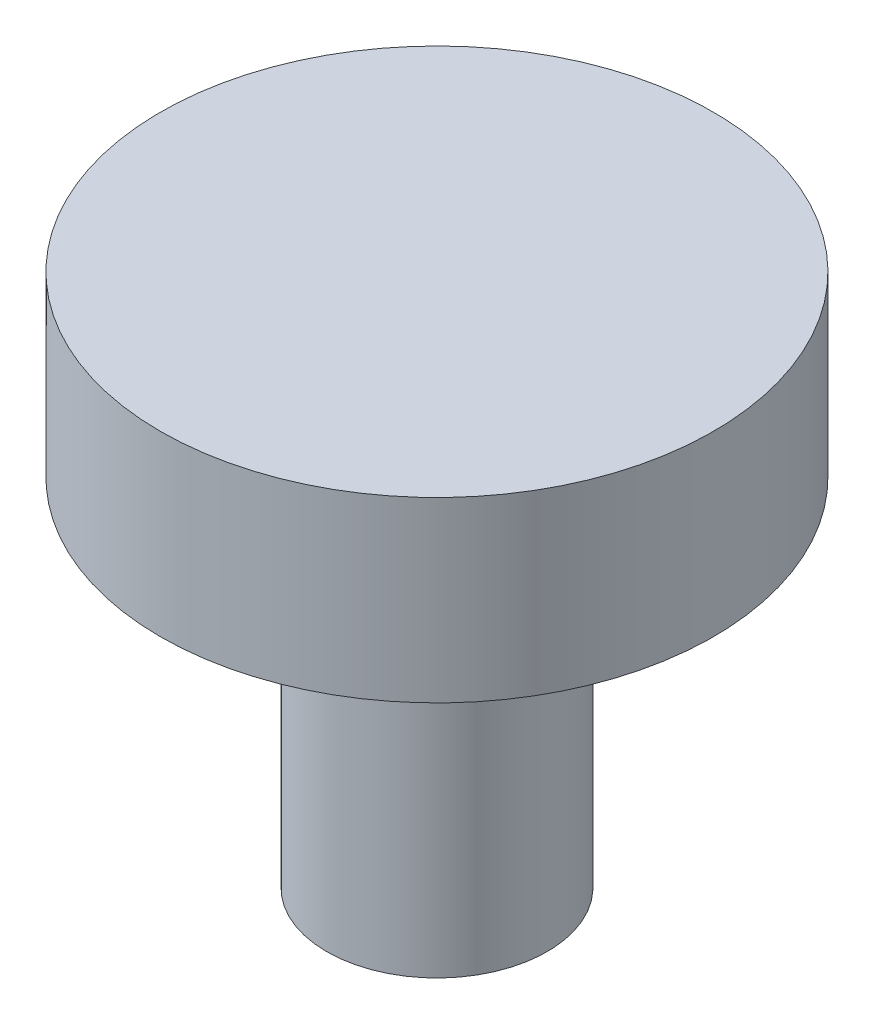
ISO-10303-21;
HEADER;
FILE_DESCRIPTION(('STEP AP214'),'2;1');
FILE_NAME('part.step','',(''),(''),'','','');
FILE_SCHEMA(('AUTOMOTIVE_DESIGN { 1 0 10303 214 1 1 1 1 }'));
ENDSEC;
DATA;
#1=APPLICATION_CONTEXT('core data for automotive mechanical design processes');
#2=APPLICATION_PROTOCOL_DEFINITION('international standard','automotive_design',2000,#1);
#3=PRODUCT_CONTEXT('',#1,'mechanical');
#4=PRODUCT('Part','Part','',(#3));
#5=PRODUCT_RELATED_PRODUCT_CATEGORY('part','',(#4));
#6=PRODUCT_DEFINITION_FORMATION('','',#4);
#7=PRODUCT_DEFINITION_CONTEXT('part definition',#1,'design');
#8=PRODUCT_DEFINITION('design','',#6,#7);
#9=PRODUCT_DEFINITION_SHAPE('','',#8);
#10=(LENGTH_UNIT() NAMED_UNIT(*) SI_UNIT(.MILLI.,.METRE.));
#11=(NAMED_UNIT(*) PLANE_ANGLE_UNIT() SI_UNIT($,.RADIAN.));
#12=(NAMED_UNIT(*) SI_UNIT($,.STERADIAN.) SOLID_ANGLE_UNIT());
#13=UNCERTAINTY_MEASURE_WITH_UNIT(LENGTH_MEASURE(1.E-05),#10,'distance_accuracy_value','');
#14=(GEOMETRIC_REPRESENTATION_CONTEXT(3) GLOBAL_UNCERTAINTY_ASSIGNED_CONTEXT((#13)) GLOBAL_UNIT_ASSIGNED_CONTEXT((#10,
#11,#12)) REPRESENTATION_CONTEXT('',''));
#15=CARTESIAN_POINT('',(0.,0.,0.));
#16=DIRECTION('',(0.,0.,1.));
#17=DIRECTION('',(1.,0.,0.));
#18=AXIS2_PLACEMENT_3D('',#15,#16,#17);
#19=CARTESIAN_POINT('',(0.,50.8,0.));
#20=DIRECTION('',(0.,-1.,0.));
#21=DIRECTION('',(0.,0.,-1.));
#22=AXIS2_PLACEMENT_3D('',#19,#20,#21);
#23=CYLINDRICAL_SURFACE('',#22,15.748);
#24=CARTESIAN_POINT('',(0.,50.8,0.));
#25=DIRECTION('',(0.,1.,0.));
#26=DIRECTION('',(0.,0.,1.));
#27=AXIS2_PLACEMENT_3D('',#24,#25,#26);
#28=CIRCLE('',#27,15.748);
#29=CARTESIAN_POINT('',(0.,50.8,15.748));
#30=VERTEX_POINT('',#29);
#31=EDGE_CURVE('E10',#30,#30,#28,.T.);
#32=ORIENTED_EDGE('',*,*,#31,.F.);
#33=EDGE_LOOP('',(#32));
#34=FACE_BOUND('',#33,.T.);
#35=CARTESIAN_POINT('',(0.,0.,0.));
#36=DIRECTION('',(0.,1.,0.));
#37=DIRECTION('',(0.,0.,1.));
#38=AXIS2_PLACEMENT_3D('',#35,#36,#37);
#39=CIRCLE('',#38,15.748);
#40=CARTESIAN_POINT('',(0.,0.,15.748));
#41=VERTEX_POINT('',#40);
#42=EDGE_CURVE('E37',#41,#41,#39,.T.);
#43=ORIENTED_EDGE('',*,*,#42,.T.);
#44=EDGE_LOOP('',(#43));
#45=FACE_BOUND('',#44,.T.);
#46=ADVANCED_FACE('F34',(#34,#45),#23,.T.);
#47=CARTESIAN_POINT('',(0.,0.,0.));
#48=DIRECTION('',(0.,1.,0.));
#49=DIRECTION('',(0.,0.,1.));
#50=AXIS2_PLACEMENT_3D('',#47,#48,#49);
#51=PLANE('',#50);
#52=ORIENTED_EDGE('',*,*,#42,.F.);
#53=EDGE_LOOP('',(#52));
#54=FACE_BOUND('',#53,.T.);
#55=ADVANCED_FACE('F57',(#54),#51,.F.);
#56=CARTESIAN_POINT('',(0.,76.2,0.));
#57=DIRECTION('',(0.,-1.,0.));
#58=DIRECTION('',(0.,0.,-1.));
#59=AXIS2_PLACEMENT_3D('',#56,#57,#58);
#60=CYLINDRICAL_SURFACE('',#59,39.4809906648136);
#61=CARTESIAN_POINT('',(0.,76.2,0.));
#62=DIRECTION('',(0.,1.,0.));
#63=DIRECTION('',(0.,0.,1.));
#64=AXIS2_PLACEMENT_3D('',#61,#62,#63);
#65=CIRCLE('',#64,39.4809906648136);
#66=CARTESIAN_POINT('',(0.,76.2,39.4809906648136));
#67=VERTEX_POINT('',#66);
#68=EDGE_CURVE('E44',#67,#67,#65,.T.);
#69=ORIENTED_EDGE('',*,*,#68,.F.);
#70=EDGE_LOOP('',(#69));
#71=FACE_BOUND('',#70,.T.);
#72=CARTESIAN_POINT('',(0.,50.8,0.));
#73=DIRECTION('',(0.,1.,0.));
#74=DIRECTION('',(0.,0.,1.));
#75=AXIS2_PLACEMENT_3D('',#72,#73,#74);
#76=CIRCLE('',#75,39.4809906648136);
#77=CARTESIAN_POINT('',(0.,50.8,39.4809906648136));
#78=VERTEX_POINT('',#77);
#79=EDGE_CURVE('E46',#78,#78,#76,.T.);
#80=ORIENTED_EDGE('',*,*,#79,.T.);
#81=EDGE_LOOP('',(#80));
#82=FACE_BOUND('',#81,.T.);
#83=ADVANCED_FACE('F54',(#71,#82),#60,.T.);
#84=CARTESIAN_POINT('',(0.,76.2,0.));
#85=DIRECTION('',(0.,1.,0.));
#86=DIRECTION('',(0.,0.,1.));
#87=AXIS2_PLACEMENT_3D('',#84,#85,#86);
#88=PLANE('',#87);
#89=ORIENTED_EDGE('',*,*,#68,.T.);
#90=EDGE_LOOP('',(#89));
#91=FACE_BOUND('',#90,.T.);
#92=ADVANCED_FACE('F52',(#91),#88,.T.);
#93=CARTESIAN_POINT('',(0.,50.8,0.));
#94=DIRECTION('',(0.,1.,0.));
#95=DIRECTION('',(0.,0.,1.));
#96=AXIS2_PLACEMENT_3D('',#93,#94,#95);
#97=PLANE('',#96);
#98=ORIENTED_EDGE('',*,*,#31,.T.);
#99=EDGE_LOOP('',(#98));
#100=FACE_BOUND('',#99,.T.);
#101=ORIENTED_EDGE('',*,*,#79,.F.);
#102=EDGE_LOOP('',(#101));
#103=FACE_BOUND('',#102,.T.);
#104=ADVANCED_FACE('F61',(#100,#103),#97,.F.);
#105=CLOSED_SHELL('',(#46,#55,#83,#92,#104));
#106=MANIFOLD_SOLID_BREP('B2',#105);
#107=ADVANCED_BREP_SHAPE_REPRESENTATION('',(#18,#106),#14);
#108=SHAPE_DEFINITION_REPRESENTATION(#9,#107);
ENDSEC;
END-ISO-10303-21;
